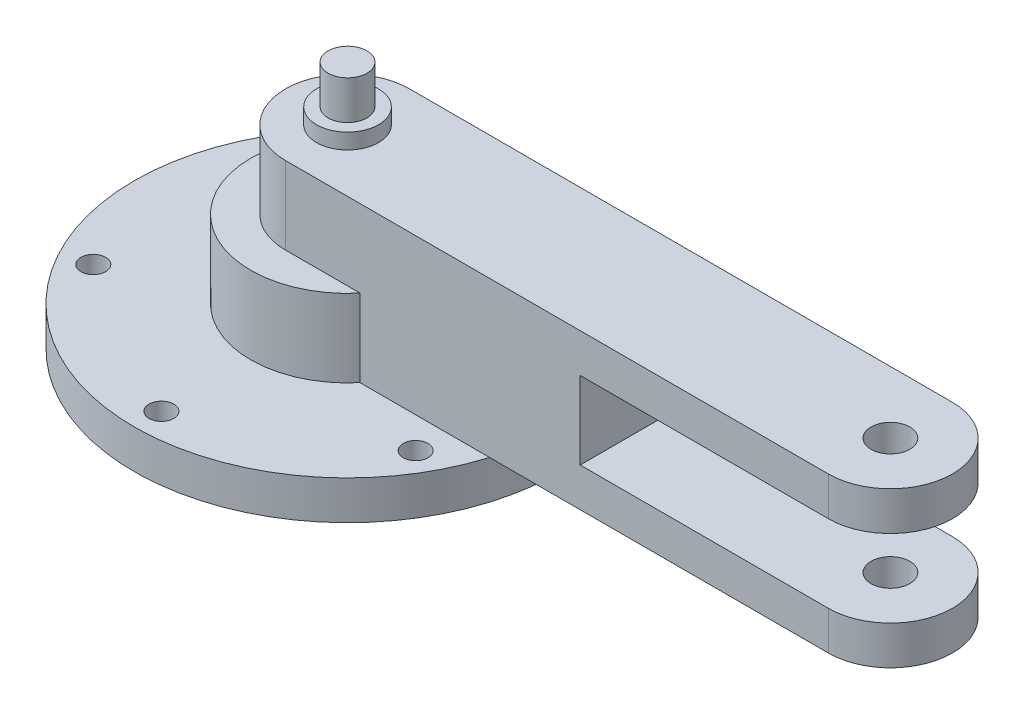
ISO-10303-21;
HEADER;
FILE_DESCRIPTION(('STEP AP214'),'2;1');
FILE_NAME('part.step','',(''),(''),'','','');
FILE_SCHEMA(('AUTOMOTIVE_DESIGN { 1 0 10303 214 1 1 1 1 }'));
ENDSEC;
DATA;
#1=APPLICATION_CONTEXT('core data for automotive mechanical design processes');
#2=APPLICATION_PROTOCOL_DEFINITION('international standard','automotive_design',2000,#1);
#3=PRODUCT_CONTEXT('',#1,'mechanical');
#4=PRODUCT('Part','Part','',(#3));
#5=PRODUCT_RELATED_PRODUCT_CATEGORY('part','',(#4));
#6=PRODUCT_DEFINITION_FORMATION('','',#4);
#7=PRODUCT_DEFINITION_CONTEXT('part definition',#1,'design');
#8=PRODUCT_DEFINITION('design','',#6,#7);
#9=PRODUCT_DEFINITION_SHAPE('','',#8);
#10=(LENGTH_UNIT() NAMED_UNIT(*) SI_UNIT(.MILLI.,.METRE.));
#11=(NAMED_UNIT(*) PLANE_ANGLE_UNIT() SI_UNIT($,.RADIAN.));
#12=(NAMED_UNIT(*) SI_UNIT($,.STERADIAN.) SOLID_ANGLE_UNIT());
#13=UNCERTAINTY_MEASURE_WITH_UNIT(LENGTH_MEASURE(1.E-05),#10,'distance_accuracy_value','');
#14=(GEOMETRIC_REPRESENTATION_CONTEXT(3) GLOBAL_UNCERTAINTY_ASSIGNED_CONTEXT((#13)) GLOBAL_UNIT_ASSIGNED_CONTEXT((#10,
#11,#12)) REPRESENTATION_CONTEXT('',''));
#15=CARTESIAN_POINT('',(0.,0.,0.));
#16=DIRECTION('',(0.,0.,1.));
#17=DIRECTION('',(1.,0.,0.));
#18=AXIS2_PLACEMENT_3D('',#15,#16,#17);
#19=CARTESIAN_POINT('',(0.,10.,8.));
#20=DIRECTION('',(0.,0.,-1.));
#21=DIRECTION('',(-1.,0.,0.));
#22=AXIS2_PLACEMENT_3D('',#19,#20,#21);
#23=PLANE('',#22);
#24=DIRECTION('',(0.,-1.,0.));
#25=VECTOR('',#24,1.);
#26=CARTESIAN_POINT('',(9.60468635614927,0.,8.));
#27=LINE('',#26,#25);
#28=CARTESIAN_POINT('',(9.60468635614927,-10.,8.));
#29=VERTEX_POINT('',#28);
#30=CARTESIAN_POINT('',(9.60468635614927,0.,8.));
#31=VERTEX_POINT('',#30);
#32=EDGE_CURVE('E133',#29,#31,#27,.F.);
#33=ORIENTED_EDGE('',*,*,#32,.F.);
#34=DIRECTION('',(1.,0.,0.));
#35=VECTOR('',#34,1.);
#36=CARTESIAN_POINT('',(0.,-10.,8.));
#37=LINE('',#36,#35);
#38=CARTESIAN_POINT('',(26.3106442338457,-10.,8.));
#39=VERTEX_POINT('',#38);
#40=EDGE_CURVE('E120',#29,#39,#37,.T.);
#41=ORIENTED_EDGE('',*,*,#40,.T.);
#42=CARTESIAN_POINT('',(70.,-10.,8.));
#43=VERTEX_POINT('',#42);
#44=EDGE_CURVE('E131',#39,#43,#37,.T.);
#45=ORIENTED_EDGE('',*,*,#44,.T.);
#46=DIRECTION('',(0.,-1.,0.));
#47=VECTOR('',#46,1.);
#48=CARTESIAN_POINT('',(70.,10.,8.));
#49=LINE('',#48,#47);
#50=CARTESIAN_POINT('',(70.,-5.,8.));
#51=VERTEX_POINT('',#50);
#52=EDGE_CURVE('E152',#51,#43,#49,.T.);
#53=ORIENTED_EDGE('',*,*,#52,.F.);
#54=DIRECTION('',(1.,0.,0.));
#55=VECTOR('',#54,1.);
#56=CARTESIAN_POINT('',(78.,-5.,8.));
#57=LINE('',#56,#55);
#58=CARTESIAN_POINT('',(38.,-5.00000000000001,8.));
#59=VERTEX_POINT('',#58);
#60=EDGE_CURVE('E179',#59,#51,#57,.T.);
#61=ORIENTED_EDGE('',*,*,#60,.F.);
#62=DIRECTION('',(0.,-1.,0.));
#63=VECTOR('',#62,1.);
#64=CARTESIAN_POINT('',(38.,4.99999999999999,8.));
#65=LINE('',#64,#63);
#66=CARTESIAN_POINT('',(38.,4.99999999999999,8.));
#67=VERTEX_POINT('',#66);
#68=EDGE_CURVE('E182',#67,#59,#65,.T.);
#69=ORIENTED_EDGE('',*,*,#68,.F.);
#70=DIRECTION('',(-1.,0.,0.));
#71=VECTOR('',#70,1.);
#72=CARTESIAN_POINT('',(78.,5.,8.));
#73=LINE('',#72,#71);
#74=CARTESIAN_POINT('',(70.,5.,8.));
#75=VERTEX_POINT('',#74);
#76=EDGE_CURVE('E185',#75,#67,#73,.T.);
#77=ORIENTED_EDGE('',*,*,#76,.F.);
#78=CARTESIAN_POINT('',(70.,10.,8.));
#79=VERTEX_POINT('',#78);
#80=EDGE_CURVE('E142',#79,#75,#49,.T.);
#81=ORIENTED_EDGE('',*,*,#80,.F.);
#82=DIRECTION('',(1.,0.,0.));
#83=VECTOR('',#82,1.);
#84=CARTESIAN_POINT('',(0.,10.,8.));
#85=LINE('',#84,#83);
#86=CARTESIAN_POINT('',(0.,10.,8.));
#87=VERTEX_POINT('',#86);
#88=EDGE_CURVE('E170',#87,#79,#85,.T.);
#89=ORIENTED_EDGE('',*,*,#88,.F.);
#90=DIRECTION('',(0.,-1.,0.));
#91=VECTOR('',#90,1.);
#92=CARTESIAN_POINT('',(0.,10.,8.));
#93=LINE('',#92,#91);
#94=CARTESIAN_POINT('',(0.,0.,8.));
#95=VERTEX_POINT('',#94);
#96=EDGE_CURVE('E141',#87,#95,#93,.T.);
#97=ORIENTED_EDGE('',*,*,#96,.T.);
#98=DIRECTION('',(1.,0.,0.));
#99=VECTOR('',#98,1.);
#100=CARTESIAN_POINT('',(0.,0.,8.));
#101=LINE('',#100,#99);
#102=EDGE_CURVE('E51',#95,#31,#101,.T.);
#103=ORIENTED_EDGE('',*,*,#102,.T.);
#104=EDGE_LOOP('',(#33,#41,#45,#53,#61,#69,#77,#81,#89,#97,#103));
#105=FACE_BOUND('',#104,.T.);
#106=ADVANCED_FACE('F36',(#105),#23,.F.);
#107=CARTESIAN_POINT('',(0.,10.,-8.));
#108=DIRECTION('',(0.,0.,1.));
#109=DIRECTION('',(1.,0.,0.));
#110=AXIS2_PLACEMENT_3D('',#107,#108,#109);
#111=PLANE('',#110);
#112=DIRECTION('',(0.,-1.,0.));
#113=VECTOR('',#112,1.);
#114=CARTESIAN_POINT('',(9.60468635614927,0.,-8.));
#115=LINE('',#114,#113);
#116=CARTESIAN_POINT('',(9.60468635614927,0.,-8.));
#117=VERTEX_POINT('',#116);
#118=CARTESIAN_POINT('',(9.60468635614927,-10.,-8.));
#119=VERTEX_POINT('',#118);
#120=EDGE_CURVE('E137',#117,#119,#115,.T.);
#121=ORIENTED_EDGE('',*,*,#120,.F.);
#122=DIRECTION('',(-1.,0.,0.));
#123=VECTOR('',#122,1.);
#124=CARTESIAN_POINT('',(0.,0.,-8.));
#125=LINE('',#124,#123);
#126=CARTESIAN_POINT('',(0.,0.,-8.));
#127=VERTEX_POINT('',#126);
#128=EDGE_CURVE('E11',#117,#127,#125,.T.);
#129=ORIENTED_EDGE('',*,*,#128,.T.);
#130=DIRECTION('',(0.,-1.,0.));
#131=VECTOR('',#130,1.);
#132=CARTESIAN_POINT('',(0.,10.,-8.));
#133=LINE('',#132,#131);
#134=CARTESIAN_POINT('',(0.,10.,-8.));
#135=VERTEX_POINT('',#134);
#136=EDGE_CURVE('E157',#135,#127,#133,.T.);
#137=ORIENTED_EDGE('',*,*,#136,.F.);
#138=DIRECTION('',(-1.,0.,0.));
#139=VECTOR('',#138,1.);
#140=CARTESIAN_POINT('',(0.,10.,-8.));
#141=LINE('',#140,#139);
#142=CARTESIAN_POINT('',(70.,10.,-8.));
#143=VERTEX_POINT('',#142);
#144=EDGE_CURVE('E159',#143,#135,#141,.T.);
#145=ORIENTED_EDGE('',*,*,#144,.F.);
#146=DIRECTION('',(0.,-1.,0.));
#147=VECTOR('',#146,1.);
#148=CARTESIAN_POINT('',(70.,10.,-8.));
#149=LINE('',#148,#147);
#150=CARTESIAN_POINT('',(70.,5.,-8.));
#151=VERTEX_POINT('',#150);
#152=EDGE_CURVE('E153',#143,#151,#149,.T.);
#153=ORIENTED_EDGE('',*,*,#152,.T.);
#154=DIRECTION('',(1.,0.,0.));
#155=VECTOR('',#154,1.);
#156=CARTESIAN_POINT('',(78.,5.,-8.));
#157=LINE('',#156,#155);
#158=CARTESIAN_POINT('',(38.,4.99999999999999,-8.));
#159=VERTEX_POINT('',#158);
#160=EDGE_CURVE('E174',#159,#151,#157,.T.);
#161=ORIENTED_EDGE('',*,*,#160,.F.);
#162=DIRECTION('',(0.,1.,0.));
#163=VECTOR('',#162,1.);
#164=CARTESIAN_POINT('',(38.,4.99999999999999,-8.));
#165=LINE('',#164,#163);
#166=CARTESIAN_POINT('',(38.,-5.00000000000001,-8.));
#167=VERTEX_POINT('',#166);
#168=EDGE_CURVE('E190',#167,#159,#165,.T.);
#169=ORIENTED_EDGE('',*,*,#168,.F.);
#170=DIRECTION('',(-1.,0.,0.));
#171=VECTOR('',#170,1.);
#172=CARTESIAN_POINT('',(78.,-5.,-8.));
#173=LINE('',#172,#171);
#174=CARTESIAN_POINT('',(70.,-5.,-8.));
#175=VERTEX_POINT('',#174);
#176=EDGE_CURVE('E188',#175,#167,#173,.T.);
#177=ORIENTED_EDGE('',*,*,#176,.F.);
#178=CARTESIAN_POINT('',(70.,-10.,-8.));
#179=VERTEX_POINT('',#178);
#180=EDGE_CURVE('E156',#175,#179,#149,.T.);
#181=ORIENTED_EDGE('',*,*,#180,.T.);
#182=DIRECTION('',(-1.,0.,0.));
#183=VECTOR('',#182,1.);
#184=CARTESIAN_POINT('',(0.,-10.,-8.));
#185=LINE('',#184,#183);
#186=CARTESIAN_POINT('',(26.3106442338457,-10.,-8.));
#187=VERTEX_POINT('',#186);
#188=EDGE_CURVE('E160',#179,#187,#185,.T.);
#189=ORIENTED_EDGE('',*,*,#188,.T.);
#190=EDGE_CURVE('E164',#187,#119,#185,.T.);
#191=ORIENTED_EDGE('',*,*,#190,.T.);
#192=EDGE_LOOP('',(#121,#129,#137,#145,#153,#161,#169,#177,#181,#189,#191));
#193=FACE_BOUND('',#192,.T.);
#194=ADVANCED_FACE('F299',(#193),#111,.F.);
#195=CARTESIAN_POINT('',(70.,10.,0.));
#196=DIRECTION('',(0.,-1.,0.));
#197=DIRECTION('',(0.,0.,-1.));
#198=AXIS2_PLACEMENT_3D('',#195,#196,#197);
#199=CYLINDRICAL_SURFACE('',#198,8.);
#200=ORIENTED_EDGE('',*,*,#180,.F.);
#201=CARTESIAN_POINT('',(70.,-5.,0.));
#202=DIRECTION('',(0.,-1.,0.));
#203=DIRECTION('',(1.,0.,0.));
#204=AXIS2_PLACEMENT_3D('',#201,#202,#203);
#205=CIRCLE('',#204,8.);
#206=EDGE_CURVE('E193',#51,#175,#205,.F.);
#207=ORIENTED_EDGE('',*,*,#206,.F.);
#208=ORIENTED_EDGE('',*,*,#52,.T.);
#209=CARTESIAN_POINT('',(70.,-10.,0.));
#210=DIRECTION('',(0.,1.,0.));
#211=DIRECTION('',(0.,0.,1.));
#212=AXIS2_PLACEMENT_3D('',#209,#210,#211);
#213=CIRCLE('',#212,8.);
#214=EDGE_CURVE('E130',#43,#179,#213,.T.);
#215=ORIENTED_EDGE('',*,*,#214,.T.);
#216=EDGE_LOOP('',(#200,#207,#208,#215));
#217=FACE_BOUND('',#216,.T.);
#218=ADVANCED_FACE('F312',(#217),#199,.T.);
#219=CARTESIAN_POINT('',(0.,10.,0.));
#220=DIRECTION('',(0.,-1.,0.));
#221=DIRECTION('',(0.,0.,-1.));
#222=AXIS2_PLACEMENT_3D('',#219,#220,#221);
#223=CYLINDRICAL_SURFACE('',#222,8.);
#224=ORIENTED_EDGE('',*,*,#136,.T.);
#225=CARTESIAN_POINT('',(0.,0.,0.));
#226=DIRECTION('',(0.,1.,0.));
#227=DIRECTION('',(0.,0.,1.));
#228=AXIS2_PLACEMENT_3D('',#225,#226,#227);
#229=CIRCLE('',#228,8.);
#230=EDGE_CURVE('E59',#127,#95,#229,.T.);
#231=ORIENTED_EDGE('',*,*,#230,.T.);
#232=ORIENTED_EDGE('',*,*,#96,.F.);
#233=CARTESIAN_POINT('',(0.,10.,0.));
#234=DIRECTION('',(0.,1.,0.));
#235=DIRECTION('',(0.,0.,1.));
#236=AXIS2_PLACEMENT_3D('',#233,#234,#235);
#237=CIRCLE('',#236,8.);
#238=EDGE_CURVE('E163',#135,#87,#237,.T.);
#239=ORIENTED_EDGE('',*,*,#238,.F.);
#240=EDGE_LOOP('',(#224,#231,#232,#239));
#241=FACE_BOUND('',#240,.T.);
#242=ADVANCED_FACE('F38',(#241),#223,.T.);
#243=ORIENTED_EDGE('',*,*,#80,.T.);
#244=CARTESIAN_POINT('',(70.,5.,0.));
#245=DIRECTION('',(0.,1.,0.));
#246=DIRECTION('',(-1.,0.,0.));
#247=AXIS2_PLACEMENT_3D('',#244,#245,#246);
#248=CIRCLE('',#247,8.);
#249=EDGE_CURVE('E195',#151,#75,#248,.F.);
#250=ORIENTED_EDGE('',*,*,#249,.F.);
#251=ORIENTED_EDGE('',*,*,#152,.F.);
#252=CARTESIAN_POINT('',(70.,10.,0.));
#253=DIRECTION('',(0.,1.,0.));
#254=DIRECTION('',(0.,0.,1.));
#255=AXIS2_PLACEMENT_3D('',#252,#253,#254);
#256=CIRCLE('',#255,8.);
#257=EDGE_CURVE('E168',#79,#143,#256,.T.);
#258=ORIENTED_EDGE('',*,*,#257,.F.);
#259=EDGE_LOOP('',(#243,#250,#251,#258));
#260=FACE_BOUND('',#259,.T.);
#261=ADVANCED_FACE('F287',(#260),#199,.T.);
#262=CARTESIAN_POINT('',(0.,10.,0.));
#263=DIRECTION('',(0.,1.,0.));
#264=DIRECTION('',(0.,0.,1.));
#265=AXIS2_PLACEMENT_3D('',#262,#263,#264);
#266=PLANE('',#265);
#267=CARTESIAN_POINT('',(0.,10.,0.));
#268=DIRECTION('',(0.,1.,0.));
#269=DIRECTION('',(0.,0.,1.));
#270=AXIS2_PLACEMENT_3D('',#267,#268,#269);
#271=CIRCLE('',#270,4.);
#272=CARTESIAN_POINT('',(0.,10.,4.));
#273=VERTEX_POINT('',#272);
#274=EDGE_CURVE('E251',#273,#273,#271,.T.);
#275=ORIENTED_EDGE('',*,*,#274,.F.);
#276=EDGE_LOOP('',(#275));
#277=FACE_BOUND('',#276,.T.);
#278=CARTESIAN_POINT('',(70.,10.,0.));
#279=DIRECTION('',(0.,1.,0.));
#280=DIRECTION('',(0.,0.,1.));
#281=AXIS2_PLACEMENT_3D('',#278,#279,#280);
#282=CIRCLE('',#281,2.5);
#283=CARTESIAN_POINT('',(70.,10.,2.5));
#284=VERTEX_POINT('',#283);
#285=EDGE_CURVE('E201',#284,#284,#282,.T.);
#286=ORIENTED_EDGE('',*,*,#285,.F.);
#287=EDGE_LOOP('',(#286));
#288=FACE_BOUND('',#287,.T.);
#289=ORIENTED_EDGE('',*,*,#238,.T.);
#290=ORIENTED_EDGE('',*,*,#88,.T.);
#291=ORIENTED_EDGE('',*,*,#257,.T.);
#292=ORIENTED_EDGE('',*,*,#144,.T.);
#293=EDGE_LOOP('',(#289,#290,#291,#292));
#294=FACE_BOUND('',#293,.T.);
#295=ADVANCED_FACE('F283',(#277,#288,#294),#266,.T.);
#296=CARTESIAN_POINT('',(0.,-10.,0.));
#297=DIRECTION('',(0.,1.,0.));
#298=DIRECTION('',(0.,0.,1.));
#299=AXIS2_PLACEMENT_3D('',#296,#297,#298);
#300=PLANE('',#299);
#301=CARTESIAN_POINT('',(0.,-10.,0.));
#302=DIRECTION('',(0.,-1.,0.));
#303=DIRECTION('',(0.,0.,-1.));
#304=AXIS2_PLACEMENT_3D('',#301,#302,#303);
#305=CIRCLE('',#304,27.5);
#306=EDGE_CURVE('E205',#187,#39,#305,.T.);
#307=ORIENTED_EDGE('',*,*,#306,.F.);
#308=ORIENTED_EDGE('',*,*,#188,.F.);
#309=ORIENTED_EDGE('',*,*,#214,.F.);
#310=ORIENTED_EDGE('',*,*,#44,.F.);
#311=EDGE_LOOP('',(#307,#308,#309,#310));
#312=FACE_BOUND('',#311,.T.);
#313=CARTESIAN_POINT('',(70.,-10.,0.));
#314=DIRECTION('',(0.,1.,0.));
#315=DIRECTION('',(0.,0.,1.));
#316=AXIS2_PLACEMENT_3D('',#313,#314,#315);
#317=CIRCLE('',#316,2.5);
#318=CARTESIAN_POINT('',(70.,-10.,2.5));
#319=VERTEX_POINT('',#318);
#320=EDGE_CURVE('E148',#319,#319,#317,.F.);
#321=ORIENTED_EDGE('',*,*,#320,.F.);
#322=EDGE_LOOP('',(#321));
#323=FACE_BOUND('',#322,.T.);
#324=ADVANCED_FACE('F286',(#312,#323),#300,.F.);
#325=CARTESIAN_POINT('',(78.,-5.,-8.001));
#326=DIRECTION('',(0.,-1.,0.));
#327=DIRECTION('',(1.,0.,0.));
#328=AXIS2_PLACEMENT_3D('',#325,#326,#327);
#329=PLANE('',#328);
#330=CARTESIAN_POINT('',(70.,-5.,0.));
#331=DIRECTION('',(0.,-1.,0.));
#332=DIRECTION('',(1.,0.,0.));
#333=AXIS2_PLACEMENT_3D('',#330,#331,#332);
#334=CIRCLE('',#333,2.5);
#335=CARTESIAN_POINT('',(72.5,-5.,0.));
#336=VERTEX_POINT('',#335);
#337=EDGE_CURVE('E147',#336,#336,#334,.T.);
#338=ORIENTED_EDGE('',*,*,#337,.T.);
#339=EDGE_LOOP('',(#338));
#340=FACE_BOUND('',#339,.T.);
#341=ORIENTED_EDGE('',*,*,#206,.T.);
#342=ORIENTED_EDGE('',*,*,#176,.T.);
#343=DIRECTION('',(0.,0.,1.));
#344=VECTOR('',#343,1.);
#345=CARTESIAN_POINT('',(38.,-5.00000000000001,-8.001));
#346=LINE('',#345,#344);
#347=EDGE_CURVE('E176',#167,#59,#346,.T.);
#348=ORIENTED_EDGE('',*,*,#347,.T.);
#349=ORIENTED_EDGE('',*,*,#60,.T.);
#350=EDGE_LOOP('',(#341,#342,#348,#349));
#351=FACE_BOUND('',#350,.T.);
#352=ADVANCED_FACE('F315',(#340,#351),#329,.F.);
#353=CARTESIAN_POINT('',(38.,4.99999999999999,-8.001));
#354=DIRECTION('',(-1.,0.,0.));
#355=DIRECTION('',(0.,0.,1.));
#356=AXIS2_PLACEMENT_3D('',#353,#354,#355);
#357=PLANE('',#356);
#358=ORIENTED_EDGE('',*,*,#168,.T.);
#359=DIRECTION('',(0.,0.,1.));
#360=VECTOR('',#359,1.);
#361=CARTESIAN_POINT('',(38.,4.99999999999999,-8.001));
#362=LINE('',#361,#360);
#363=EDGE_CURVE('E177',#159,#67,#362,.T.);
#364=ORIENTED_EDGE('',*,*,#363,.T.);
#365=ORIENTED_EDGE('',*,*,#68,.T.);
#366=ORIENTED_EDGE('',*,*,#347,.F.);
#367=EDGE_LOOP('',(#358,#364,#365,#366));
#368=FACE_BOUND('',#367,.T.);
#369=ADVANCED_FACE('F320',(#368),#357,.F.);
#370=CARTESIAN_POINT('',(78.,5.,-8.001));
#371=DIRECTION('',(0.,1.,0.));
#372=DIRECTION('',(-1.,0.,0.));
#373=AXIS2_PLACEMENT_3D('',#370,#371,#372);
#374=PLANE('',#373);
#375=CARTESIAN_POINT('',(70.,5.,0.));
#376=DIRECTION('',(0.,1.,0.));
#377=DIRECTION('',(-1.,0.,0.));
#378=AXIS2_PLACEMENT_3D('',#375,#376,#377);
#379=CIRCLE('',#378,2.5);
#380=CARTESIAN_POINT('',(67.5,5.,0.));
#381=VERTEX_POINT('',#380);
#382=EDGE_CURVE('E145',#381,#381,#379,.T.);
#383=ORIENTED_EDGE('',*,*,#382,.T.);
#384=EDGE_LOOP('',(#383));
#385=FACE_BOUND('',#384,.T.);
#386=ORIENTED_EDGE('',*,*,#76,.T.);
#387=ORIENTED_EDGE('',*,*,#363,.F.);
#388=ORIENTED_EDGE('',*,*,#160,.T.);
#389=ORIENTED_EDGE('',*,*,#249,.T.);
#390=EDGE_LOOP('',(#386,#387,#388,#389));
#391=FACE_BOUND('',#390,.T.);
#392=ADVANCED_FACE('F328',(#385,#391),#374,.F.);
#393=CARTESIAN_POINT('',(70.,-17.0710678118655,0.));
#394=DIRECTION('',(0.,1.,0.));
#395=DIRECTION('',(0.,0.,1.));
#396=AXIS2_PLACEMENT_3D('',#393,#394,#395);
#397=CYLINDRICAL_SURFACE('',#396,2.5);
#398=ORIENTED_EDGE('',*,*,#285,.T.);
#399=EDGE_LOOP('',(#398));
#400=FACE_BOUND('',#399,.T.);
#401=ORIENTED_EDGE('',*,*,#382,.F.);
#402=EDGE_LOOP('',(#401));
#403=FACE_BOUND('',#402,.T.);
#404=ADVANCED_FACE('F330',(#400,#403),#397,.F.);
#405=ORIENTED_EDGE('',*,*,#320,.T.);
#406=EDGE_LOOP('',(#405));
#407=FACE_BOUND('',#406,.T.);
#408=ORIENTED_EDGE('',*,*,#337,.F.);
#409=EDGE_LOOP('',(#408));
#410=FACE_BOUND('',#409,.T.);
#411=ADVANCED_FACE('F337',(#407,#410),#397,.F.);
#412=CARTESIAN_POINT('',(0.,-15.,0.));
#413=DIRECTION('',(0.,1.,0.));
#414=DIRECTION('',(0.,0.,1.));
#415=AXIS2_PLACEMENT_3D('',#412,#413,#414);
#416=CYLINDRICAL_SURFACE('',#415,27.5);
#417=CARTESIAN_POINT('',(0.,-15.,0.));
#418=DIRECTION('',(0.,-1.,0.));
#419=DIRECTION('',(0.,0.,-1.));
#420=AXIS2_PLACEMENT_3D('',#417,#418,#419);
#421=CIRCLE('',#420,27.5);
#422=CARTESIAN_POINT('',(0.,-15.,-27.5));
#423=VERTEX_POINT('',#422);
#424=EDGE_CURVE('E204',#423,#423,#421,.T.);
#425=ORIENTED_EDGE('',*,*,#424,.F.);
#426=EDGE_LOOP('',(#425));
#427=FACE_BOUND('',#426,.T.);
#428=ORIENTED_EDGE('',*,*,#306,.T.);
#429=EDGE_CURVE('E127',#39,#187,#305,.T.);
#430=ORIENTED_EDGE('',*,*,#429,.T.);
#431=EDGE_LOOP('',(#428,#430));
#432=FACE_BOUND('',#431,.T.);
#433=ADVANCED_FACE('F302',(#427,#432),#416,.T.);
#434=CARTESIAN_POINT('',(0.,-15.,0.));
#435=DIRECTION('',(0.,-1.,0.));
#436=DIRECTION('',(0.,0.,-1.));
#437=AXIS2_PLACEMENT_3D('',#434,#435,#436);
#438=PLANE('',#437);
#439=CARTESIAN_POINT('',(20.7846096908265,-15.,12.0000000000001));
#440=DIRECTION('',(0.,-1.,0.));
#441=DIRECTION('',(0.,0.,-1.));
#442=AXIS2_PLACEMENT_3D('',#439,#440,#441);
#443=CIRCLE('',#442,1.6);
#444=CARTESIAN_POINT('',(20.7846096908265,-15.,10.4000000000001));
#445=VERTEX_POINT('',#444);
#446=EDGE_CURVE('E240',#445,#445,#443,.F.);
#447=ORIENTED_EDGE('',*,*,#446,.T.);
#448=EDGE_LOOP('',(#447));
#449=FACE_BOUND('',#448,.T.);
#450=CARTESIAN_POINT('',(0.,-15.,24.));
#451=DIRECTION('',(0.,-1.,0.));
#452=DIRECTION('',(0.,0.,-1.));
#453=AXIS2_PLACEMENT_3D('',#450,#451,#452);
#454=CIRCLE('',#453,1.6);
#455=CARTESIAN_POINT('',(0.,-15.,22.4));
#456=VERTEX_POINT('',#455);
#457=EDGE_CURVE('E234',#456,#456,#454,.F.);
#458=ORIENTED_EDGE('',*,*,#457,.T.);
#459=EDGE_LOOP('',(#458));
#460=FACE_BOUND('',#459,.T.);
#461=CARTESIAN_POINT('',(-20.7846096908266,-15.,11.9999999999998));
#462=DIRECTION('',(0.,-1.,0.));
#463=DIRECTION('',(0.,0.,-1.));
#464=AXIS2_PLACEMENT_3D('',#461,#462,#463);
#465=CIRCLE('',#464,1.6);
#466=CARTESIAN_POINT('',(-20.7846096908266,-15.,10.3999999999998));
#467=VERTEX_POINT('',#466);
#468=EDGE_CURVE('E228',#467,#467,#465,.F.);
#469=ORIENTED_EDGE('',*,*,#468,.T.);
#470=EDGE_LOOP('',(#469));
#471=FACE_BOUND('',#470,.T.);
#472=CARTESIAN_POINT('',(-20.7846096908264,-15.,-12.0000000000002));
#473=DIRECTION('',(0.,-1.,0.));
#474=DIRECTION('',(0.,0.,-1.));
#475=AXIS2_PLACEMENT_3D('',#472,#473,#474);
#476=CIRCLE('',#475,1.6);
#477=CARTESIAN_POINT('',(-20.7846096908264,-15.,-13.6000000000002));
#478=VERTEX_POINT('',#477);
#479=EDGE_CURVE('E222',#478,#478,#476,.F.);
#480=ORIENTED_EDGE('',*,*,#479,.T.);
#481=EDGE_LOOP('',(#480));
#482=FACE_BOUND('',#481,.T.);
#483=CARTESIAN_POINT('',(20.7846096908266,-15.,-12.));
#484=DIRECTION('',(0.,-1.,0.));
#485=DIRECTION('',(0.,0.,-1.));
#486=AXIS2_PLACEMENT_3D('',#483,#484,#485);
#487=CIRCLE('',#486,1.6);
#488=CARTESIAN_POINT('',(20.7846096908266,-15.,-13.6));
#489=VERTEX_POINT('',#488);
#490=EDGE_CURVE('E216',#489,#489,#487,.F.);
#491=ORIENTED_EDGE('',*,*,#490,.T.);
#492=EDGE_LOOP('',(#491));
#493=FACE_BOUND('',#492,.T.);
#494=CARTESIAN_POINT('',(0.,-15.,-24.));
#495=DIRECTION('',(0.,-1.,0.));
#496=DIRECTION('',(0.,0.,-1.));
#497=AXIS2_PLACEMENT_3D('',#494,#495,#496);
#498=CIRCLE('',#497,1.6);
#499=CARTESIAN_POINT('',(0.,-15.,-25.6));
#500=VERTEX_POINT('',#499);
#501=EDGE_CURVE('E209',#500,#500,#498,.F.);
#502=ORIENTED_EDGE('',*,*,#501,.T.);
#503=EDGE_LOOP('',(#502));
#504=FACE_BOUND('',#503,.T.);
#505=ORIENTED_EDGE('',*,*,#424,.T.);
#506=EDGE_LOOP('',(#505));
#507=FACE_BOUND('',#506,.T.);
#508=ADVANCED_FACE('F362',(#449,#460,#471,#482,#493,#504,#507),#438,.T.);
#509=CARTESIAN_POINT('',(0.,-10.,0.));
#510=DIRECTION('',(0.,-1.,0.));
#511=DIRECTION('',(0.,0.,-1.));
#512=AXIS2_PLACEMENT_3D('',#509,#510,#511);
#513=PLANE('',#512);
#514=CARTESIAN_POINT('',(0.,-10.,0.));
#515=DIRECTION('',(0.,-1.,0.));
#516=DIRECTION('',(0.,0.,-1.));
#517=AXIS2_PLACEMENT_3D('',#514,#515,#516);
#518=CIRCLE('',#517,12.5);
#519=EDGE_CURVE('E44',#119,#29,#518,.F.);
#520=ORIENTED_EDGE('',*,*,#519,.F.);
#521=ORIENTED_EDGE('',*,*,#190,.F.);
#522=ORIENTED_EDGE('',*,*,#429,.F.);
#523=ORIENTED_EDGE('',*,*,#40,.F.);
#524=EDGE_LOOP('',(#520,#521,#522,#523));
#525=FACE_BOUND('',#524,.T.);
#526=CARTESIAN_POINT('',(20.7846096908265,-10.,12.0000000000001));
#527=DIRECTION('',(0.,1.,0.));
#528=DIRECTION('',(-0.866025403784436,0.,-0.500000000000004));
#529=AXIS2_PLACEMENT_3D('',#526,#527,#528);
#530=CIRCLE('',#529,1.6);
#531=CARTESIAN_POINT('',(19.3989690447714,-10.,11.2000000000001));
#532=VERTEX_POINT('',#531);
#533=EDGE_CURVE('E219',#532,#532,#530,.T.);
#534=ORIENTED_EDGE('',*,*,#533,.F.);
#535=EDGE_LOOP('',(#534));
#536=FACE_BOUND('',#535,.T.);
#537=CARTESIAN_POINT('',(0.,-10.,24.));
#538=DIRECTION('',(0.,1.,0.));
#539=DIRECTION('',(0.,0.,-1.));
#540=AXIS2_PLACEMENT_3D('',#537,#538,#539);
#541=CIRCLE('',#540,1.6);
#542=CARTESIAN_POINT('',(0.,-10.,22.4));
#543=VERTEX_POINT('',#542);
#544=EDGE_CURVE('E237',#543,#543,#541,.T.);
#545=ORIENTED_EDGE('',*,*,#544,.F.);
#546=EDGE_LOOP('',(#545));
#547=FACE_BOUND('',#546,.T.);
#548=CARTESIAN_POINT('',(-20.7846096908266,-10.,11.9999999999998));
#549=DIRECTION('',(0.,1.,0.));
#550=DIRECTION('',(0.866025403784443,0.,-0.499999999999992));
#551=AXIS2_PLACEMENT_3D('',#548,#549,#550);
#552=CIRCLE('',#551,1.6);
#553=CARTESIAN_POINT('',(-19.3989690447715,-10.,11.1999999999998));
#554=VERTEX_POINT('',#553);
#555=EDGE_CURVE('E231',#554,#554,#552,.T.);
#556=ORIENTED_EDGE('',*,*,#555,.F.);
#557=EDGE_LOOP('',(#556));
#558=FACE_BOUND('',#557,.T.);
#559=CARTESIAN_POINT('',(-20.7846096908264,-10.,-12.0000000000002));
#560=DIRECTION('',(0.,1.,0.));
#561=DIRECTION('',(0.866025403784433,0.,0.50000000000001));
#562=AXIS2_PLACEMENT_3D('',#559,#560,#561);
#563=CIRCLE('',#562,1.6);
#564=CARTESIAN_POINT('',(-19.3989690447713,-10.,-11.2000000000002));
#565=VERTEX_POINT('',#564);
#566=EDGE_CURVE('E225',#565,#565,#563,.T.);
#567=ORIENTED_EDGE('',*,*,#566,.F.);
#568=EDGE_LOOP('',(#567));
#569=FACE_BOUND('',#568,.T.);
#570=CARTESIAN_POINT('',(20.7846096908266,-10.,-12.));
#571=DIRECTION('',(0.,1.,0.));
#572=DIRECTION('',(-0.86602540378444,0.,0.499999999999998));
#573=AXIS2_PLACEMENT_3D('',#570,#571,#572);
#574=CIRCLE('',#573,1.6);
#575=CARTESIAN_POINT('',(19.3989690447715,-10.,-11.2));
#576=VERTEX_POINT('',#575);
#577=EDGE_CURVE('E213',#576,#576,#574,.T.);
#578=ORIENTED_EDGE('',*,*,#577,.F.);
#579=EDGE_LOOP('',(#578));
#580=FACE_BOUND('',#579,.T.);
#581=CARTESIAN_POINT('',(0.,-10.,-24.));
#582=DIRECTION('',(0.,1.,0.));
#583=DIRECTION('',(0.,0.,1.));
#584=AXIS2_PLACEMENT_3D('',#581,#582,#583);
#585=CIRCLE('',#584,1.6);
#586=CARTESIAN_POINT('',(0.,-10.,-22.4));
#587=VERTEX_POINT('',#586);
#588=EDGE_CURVE('E212',#587,#587,#585,.T.);
#589=ORIENTED_EDGE('',*,*,#588,.F.);
#590=EDGE_LOOP('',(#589));
#591=FACE_BOUND('',#590,.T.);
#592=ADVANCED_FACE('F121',(#525,#536,#547,#558,#569,#580,#591),#513,.F.);
#593=CARTESIAN_POINT('',(0.,-15.001,-24.));
#594=DIRECTION('',(0.,1.,0.));
#595=DIRECTION('',(0.,0.,1.));
#596=AXIS2_PLACEMENT_3D('',#593,#594,#595);
#597=CYLINDRICAL_SURFACE('',#596,1.6);
#598=ORIENTED_EDGE('',*,*,#501,.F.);
#599=EDGE_LOOP('',(#598));
#600=FACE_BOUND('',#599,.T.);
#601=ORIENTED_EDGE('',*,*,#588,.T.);
#602=EDGE_LOOP('',(#601));
#603=FACE_BOUND('',#602,.T.);
#604=ADVANCED_FACE('F366',(#600,#603),#597,.F.);
#605=CARTESIAN_POINT('',(20.7846096908266,-15.001,-12.));
#606=DIRECTION('',(0.,1.,0.));
#607=DIRECTION('',(0.,0.,1.));
#608=AXIS2_PLACEMENT_3D('',#605,#606,#607);
#609=CYLINDRICAL_SURFACE('',#608,1.6);
#610=ORIENTED_EDGE('',*,*,#490,.F.);
#611=EDGE_LOOP('',(#610));
#612=FACE_BOUND('',#611,.T.);
#613=ORIENTED_EDGE('',*,*,#577,.T.);
#614=EDGE_LOOP('',(#613));
#615=FACE_BOUND('',#614,.T.);
#616=ADVANCED_FACE('F372',(#612,#615),#609,.F.);
#617=CARTESIAN_POINT('',(-20.7846096908264,-15.001,-12.0000000000002));
#618=DIRECTION('',(0.,1.,0.));
#619=DIRECTION('',(0.,0.,1.));
#620=AXIS2_PLACEMENT_3D('',#617,#618,#619);
#621=CYLINDRICAL_SURFACE('',#620,1.6);
#622=ORIENTED_EDGE('',*,*,#479,.F.);
#623=EDGE_LOOP('',(#622));
#624=FACE_BOUND('',#623,.T.);
#625=ORIENTED_EDGE('',*,*,#566,.T.);
#626=EDGE_LOOP('',(#625));
#627=FACE_BOUND('',#626,.T.);
#628=ADVANCED_FACE('F376',(#624,#627),#621,.F.);
#629=CARTESIAN_POINT('',(-20.7846096908266,-15.001,11.9999999999998));
#630=DIRECTION('',(0.,1.,0.));
#631=DIRECTION('',(0.,0.,1.));
#632=AXIS2_PLACEMENT_3D('',#629,#630,#631);
#633=CYLINDRICAL_SURFACE('',#632,1.6);
#634=ORIENTED_EDGE('',*,*,#468,.F.);
#635=EDGE_LOOP('',(#634));
#636=FACE_BOUND('',#635,.T.);
#637=ORIENTED_EDGE('',*,*,#555,.T.);
#638=EDGE_LOOP('',(#637));
#639=FACE_BOUND('',#638,.T.);
#640=ADVANCED_FACE('F380',(#636,#639),#633,.F.);
#641=CARTESIAN_POINT('',(0.,-15.001,24.));
#642=DIRECTION('',(0.,1.,0.));
#643=DIRECTION('',(0.,0.,1.));
#644=AXIS2_PLACEMENT_3D('',#641,#642,#643);
#645=CYLINDRICAL_SURFACE('',#644,1.6);
#646=ORIENTED_EDGE('',*,*,#457,.F.);
#647=EDGE_LOOP('',(#646));
#648=FACE_BOUND('',#647,.T.);
#649=ORIENTED_EDGE('',*,*,#544,.T.);
#650=EDGE_LOOP('',(#649));
#651=FACE_BOUND('',#650,.T.);
#652=ADVANCED_FACE('F384',(#648,#651),#645,.F.);
#653=CARTESIAN_POINT('',(20.7846096908265,-15.001,12.0000000000001));
#654=DIRECTION('',(0.,1.,0.));
#655=DIRECTION('',(0.,0.,1.));
#656=AXIS2_PLACEMENT_3D('',#653,#654,#655);
#657=CYLINDRICAL_SURFACE('',#656,1.6);
#658=ORIENTED_EDGE('',*,*,#446,.F.);
#659=EDGE_LOOP('',(#658));
#660=FACE_BOUND('',#659,.T.);
#661=ORIENTED_EDGE('',*,*,#533,.T.);
#662=EDGE_LOOP('',(#661));
#663=FACE_BOUND('',#662,.T.);
#664=ADVANCED_FACE('F388',(#660,#663),#657,.F.);
#665=CARTESIAN_POINT('',(0.,0.,0.));
#666=DIRECTION('',(0.,1.,0.));
#667=DIRECTION('',(0.,0.,1.));
#668=AXIS2_PLACEMENT_3D('',#665,#666,#667);
#669=PLANE('',#668);
#670=ORIENTED_EDGE('',*,*,#102,.F.);
#671=ORIENTED_EDGE('',*,*,#230,.F.);
#672=ORIENTED_EDGE('',*,*,#128,.F.);
#673=CARTESIAN_POINT('',(0.,0.,0.));
#674=DIRECTION('',(0.,1.,0.));
#675=DIRECTION('',(0.,0.,1.));
#676=AXIS2_PLACEMENT_3D('',#673,#674,#675);
#677=CIRCLE('',#676,12.5);
#678=EDGE_CURVE('E248',#117,#31,#677,.T.);
#679=ORIENTED_EDGE('',*,*,#678,.T.);
#680=EDGE_LOOP('',(#670,#671,#672,#679));
#681=FACE_BOUND('',#680,.T.);
#682=ADVANCED_FACE('F296',(#681),#669,.T.);
#683=CARTESIAN_POINT('',(0.,0.,0.));
#684=DIRECTION('',(0.,-1.,0.));
#685=DIRECTION('',(0.,0.,-1.));
#686=AXIS2_PLACEMENT_3D('',#683,#684,#685);
#687=CYLINDRICAL_SURFACE('',#686,12.5);
#688=ORIENTED_EDGE('',*,*,#519,.T.);
#689=ORIENTED_EDGE('',*,*,#32,.T.);
#690=ORIENTED_EDGE('',*,*,#678,.F.);
#691=ORIENTED_EDGE('',*,*,#120,.T.);
#692=EDGE_LOOP('',(#688,#689,#690,#691));
#693=FACE_BOUND('',#692,.T.);
#694=ADVANCED_FACE('F140',(#693),#687,.T.);
#695=CARTESIAN_POINT('',(0.,12.,0.));
#696=DIRECTION('',(0.,-1.,0.));
#697=DIRECTION('',(0.,0.,-1.));
#698=AXIS2_PLACEMENT_3D('',#695,#696,#697);
#699=CYLINDRICAL_SURFACE('',#698,4.);
#700=CARTESIAN_POINT('',(0.,12.,0.));
#701=DIRECTION('',(0.,1.,0.));
#702=DIRECTION('',(0.,0.,1.));
#703=AXIS2_PLACEMENT_3D('',#700,#701,#702);
#704=CIRCLE('',#703,4.);
#705=CARTESIAN_POINT('',(0.,12.,4.));
#706=VERTEX_POINT('',#705);
#707=EDGE_CURVE('E250',#706,#706,#704,.T.);
#708=ORIENTED_EDGE('',*,*,#707,.F.);
#709=EDGE_LOOP('',(#708));
#710=FACE_BOUND('',#709,.T.);
#711=ORIENTED_EDGE('',*,*,#274,.T.);
#712=EDGE_LOOP('',(#711));
#713=FACE_BOUND('',#712,.T.);
#714=ADVANCED_FACE('F274',(#710,#713),#699,.T.);
#715=CARTESIAN_POINT('',(0.,12.,0.));
#716=DIRECTION('',(0.,1.,0.));
#717=DIRECTION('',(0.,0.,1.));
#718=AXIS2_PLACEMENT_3D('',#715,#716,#717);
#719=PLANE('',#718);
#720=CARTESIAN_POINT('',(0.,12.,0.));
#721=DIRECTION('',(0.,1.,0.));
#722=DIRECTION('',(0.,0.,1.));
#723=AXIS2_PLACEMENT_3D('',#720,#721,#722);
#724=CIRCLE('',#723,2.5);
#725=CARTESIAN_POINT('',(0.,12.,2.5));
#726=VERTEX_POINT('',#725);
#727=EDGE_CURVE('E257',#726,#726,#724,.T.);
#728=ORIENTED_EDGE('',*,*,#727,.F.);
#729=EDGE_LOOP('',(#728));
#730=FACE_BOUND('',#729,.T.);
#731=ORIENTED_EDGE('',*,*,#707,.T.);
#732=EDGE_LOOP('',(#731));
#733=FACE_BOUND('',#732,.T.);
#734=ADVANCED_FACE('F268',(#730,#733),#719,.T.);
#735=CARTESIAN_POINT('',(0.,17.,0.));
#736=DIRECTION('',(0.,-1.,0.));
#737=DIRECTION('',(0.,0.,-1.));
#738=AXIS2_PLACEMENT_3D('',#735,#736,#737);
#739=CYLINDRICAL_SURFACE('',#738,2.5);
#740=CARTESIAN_POINT('',(0.,17.,0.));
#741=DIRECTION('',(0.,1.,0.));
#742=DIRECTION('',(0.,0.,1.));
#743=AXIS2_PLACEMENT_3D('',#740,#741,#742);
#744=CIRCLE('',#743,2.5);
#745=CARTESIAN_POINT('',(0.,17.,2.5));
#746=VERTEX_POINT('',#745);
#747=EDGE_CURVE('E254',#746,#746,#744,.T.);
#748=ORIENTED_EDGE('',*,*,#747,.F.);
#749=EDGE_LOOP('',(#748));
#750=FACE_BOUND('',#749,.T.);
#751=ORIENTED_EDGE('',*,*,#727,.T.);
#752=EDGE_LOOP('',(#751));
#753=FACE_BOUND('',#752,.T.);
#754=ADVANCED_FACE('F265',(#750,#753),#739,.T.);
#755=CARTESIAN_POINT('',(0.,17.,0.));
#756=DIRECTION('',(0.,1.,0.));
#757=DIRECTION('',(0.,0.,1.));
#758=AXIS2_PLACEMENT_3D('',#755,#756,#757);
#759=PLANE('',#758);
#760=ORIENTED_EDGE('',*,*,#747,.T.);
#761=EDGE_LOOP('',(#760));
#762=FACE_BOUND('',#761,.T.);
#763=ADVANCED_FACE('F263',(#762),#759,.T.);
#764=CLOSED_SHELL('',(#106,#194,#218,#242,#261,#295,#324,#352,#369,#392,#404,#411,#433,#508,
#592,#604,#616,#628,#640,#652,#664,#682,#694,#714,#734,#754,#763));
#765=MANIFOLD_SOLID_BREP('B2',#764);
#766=ADVANCED_BREP_SHAPE_REPRESENTATION('',(#18,#765),#14);
#767=SHAPE_DEFINITION_REPRESENTATION(#9,#766);
ENDSEC;
END-ISO-10303-21;
